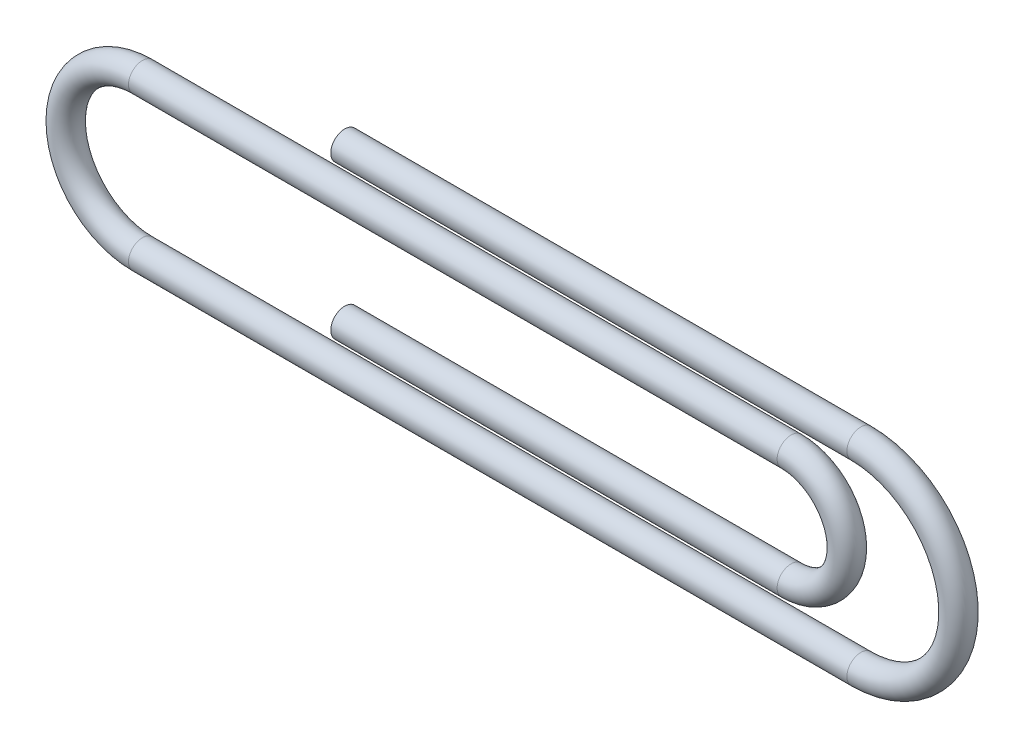
ISO-10303-21;
HEADER;
FILE_DESCRIPTION(('STEP AP214'),'2;1');
FILE_NAME('part.step','',(''),(''),'','','');
FILE_SCHEMA(('AUTOMOTIVE_DESIGN { 1 0 10303 214 1 1 1 1 }'));
ENDSEC;
DATA;
#1=APPLICATION_CONTEXT('core data for automotive mechanical design processes');
#2=APPLICATION_PROTOCOL_DEFINITION('international standard','automotive_design',2000,#1);
#3=PRODUCT_CONTEXT('',#1,'mechanical');
#4=PRODUCT('Part','Part','',(#3));
#5=PRODUCT_RELATED_PRODUCT_CATEGORY('part','',(#4));
#6=PRODUCT_DEFINITION_FORMATION('','',#4);
#7=PRODUCT_DEFINITION_CONTEXT('part definition',#1,'design');
#8=PRODUCT_DEFINITION('design','',#6,#7);
#9=PRODUCT_DEFINITION_SHAPE('','',#8);
#10=(LENGTH_UNIT() NAMED_UNIT(*) SI_UNIT(.MILLI.,.METRE.));
#11=(NAMED_UNIT(*) PLANE_ANGLE_UNIT() SI_UNIT($,.RADIAN.));
#12=(NAMED_UNIT(*) SI_UNIT($,.STERADIAN.) SOLID_ANGLE_UNIT());
#13=UNCERTAINTY_MEASURE_WITH_UNIT(LENGTH_MEASURE(1.E-05),#10,'distance_accuracy_value','');
#14=(GEOMETRIC_REPRESENTATION_CONTEXT(3) GLOBAL_UNCERTAINTY_ASSIGNED_CONTEXT((#13)) GLOBAL_UNIT_ASSIGNED_CONTEXT((#10,
#11,#12)) REPRESENTATION_CONTEXT('',''));
#15=CARTESIAN_POINT('',(0.,0.,0.));
#16=DIRECTION('',(0.,0.,1.));
#17=DIRECTION('',(1.,0.,0.));
#18=AXIS2_PLACEMENT_3D('',#15,#16,#17);
#19=CARTESIAN_POINT('',(0.,0.,0.));
#20=DIRECTION('',(1.,0.,0.));
#21=DIRECTION('',(0.,0.,-1.));
#22=AXIS2_PLACEMENT_3D('',#19,#20,#21);
#23=PLANE('',#22);
#24=CARTESIAN_POINT('',(0.,0.,0.));
#25=DIRECTION('',(1.,0.,0.));
#26=DIRECTION('',(0.,0.,-1.));
#27=AXIS2_PLACEMENT_3D('',#24,#25,#26);
#28=CIRCLE('',#27,0.5);
#29=CARTESIAN_POINT('',(0.,0.,-0.5));
#30=VERTEX_POINT('',#29);
#31=EDGE_CURVE('E72',#30,#30,#28,.T.);
#32=ORIENTED_EDGE('',*,*,#31,.F.);
#33=EDGE_LOOP('',(#32));
#34=FACE_BOUND('',#33,.T.);
#35=ADVANCED_FACE('F37',(#34),#23,.F.);
#36=CARTESIAN_POINT('',(0.,-5.5,0.));
#37=DIRECTION('',(-1.,0.,0.));
#38=DIRECTION('',(0.,0.,-1.));
#39=AXIS2_PLACEMENT_3D('',#36,#37,#38);
#40=PLANE('',#39);
#41=CARTESIAN_POINT('',(0.,-5.5,0.));
#42=DIRECTION('',(-1.,0.,0.));
#43=DIRECTION('',(0.,0.,-1.));
#44=AXIS2_PLACEMENT_3D('',#41,#42,#43);
#45=CIRCLE('',#44,0.5);
#46=CARTESIAN_POINT('',(0.,-5.5,-0.5));
#47=VERTEX_POINT('',#46);
#48=EDGE_CURVE('E10',#47,#47,#45,.T.);
#49=ORIENTED_EDGE('',*,*,#48,.T.);
#50=EDGE_LOOP('',(#49));
#51=FACE_BOUND('',#50,.T.);
#52=ADVANCED_FACE('F80',(#51),#40,.T.);
#53=CARTESIAN_POINT('',(0.,0.,0.));
#54=DIRECTION('',(1.,0.,0.));
#55=DIRECTION('',(0.,0.,-1.));
#56=AXIS2_PLACEMENT_3D('',#53,#54,#55);
#57=CYLINDRICAL_SURFACE('',#56,0.5);
#58=CARTESIAN_POINT('',(18.5,0.,0.));
#59=DIRECTION('',(1.,0.,0.));
#60=DIRECTION('',(0.,0.,-1.));
#61=AXIS2_PLACEMENT_3D('',#58,#59,#60);
#62=CIRCLE('',#61,0.5);
#63=CARTESIAN_POINT('',(18.5,0.5,0.));
#64=VERTEX_POINT('',#63);
#65=EDGE_CURVE('E68',#64,#64,#62,.T.);
#66=ORIENTED_EDGE('',*,*,#65,.F.);
#67=EDGE_LOOP('',(#66));
#68=FACE_BOUND('',#67,.T.);
#69=ORIENTED_EDGE('',*,*,#31,.T.);
#70=EDGE_LOOP('',(#69));
#71=FACE_BOUND('',#70,.T.);
#72=ADVANCED_FACE('F77',(#68,#71),#57,.T.);
#73=CARTESIAN_POINT('',(18.5,-3.5,0.));
#74=DIRECTION('',(0.,0.,-1.));
#75=DIRECTION('',(-1.,0.,0.));
#76=AXIS2_PLACEMENT_3D('',#73,#74,#75);
#77=TOROIDAL_SURFACE('',#76,3.5,0.5);
#78=CARTESIAN_POINT('',(18.5,-7.,0.));
#79=DIRECTION('',(-1.,0.,0.));
#80=DIRECTION('',(0.,0.,-1.));
#81=AXIS2_PLACEMENT_3D('',#78,#79,#80);
#82=CIRCLE('',#81,0.5);
#83=CARTESIAN_POINT('',(18.5,-7.5,0.));
#84=VERTEX_POINT('',#83);
#85=EDGE_CURVE('E64',#84,#84,#82,.T.);
#86=CARTESIAN_POINT('',(18.5,-3.5,0.));
#87=DIRECTION('',(0.,0.,-1.));
#88=DIRECTION('',(-1.,0.,0.));
#89=AXIS2_PLACEMENT_3D('',#86,#87,#88);
#90=CIRCLE('',#89,4.);
#91=EDGE_CURVE('',#64,#84,#90,.T.);
#92=ORIENTED_EDGE('',*,*,#65,.T.);
#93=ORIENTED_EDGE('',*,*,#85,.F.);
#94=ORIENTED_EDGE('',*,*,#91,.T.);
#95=ORIENTED_EDGE('',*,*,#91,.F.);
#96=EDGE_LOOP('',(#92,#94,#93,#95));
#97=FACE_BOUND('',#96,.T.);
#98=ADVANCED_FACE('F106',(#97),#77,.T.);
#99=CARTESIAN_POINT('',(18.5,-7.,0.));
#100=DIRECTION('',(-1.,0.,0.));
#101=DIRECTION('',(0.,-1.,0.));
#102=AXIS2_PLACEMENT_3D('',#99,#100,#101);
#103=CYLINDRICAL_SURFACE('',#102,0.5);
#104=CARTESIAN_POINT('',(-7.25,-7.,0.));
#105=DIRECTION('',(-1.,0.,0.));
#106=DIRECTION('',(0.,0.,-1.));
#107=AXIS2_PLACEMENT_3D('',#104,#105,#106);
#108=CIRCLE('',#107,0.5);
#109=CARTESIAN_POINT('',(-7.25,-7.5,0.));
#110=VERTEX_POINT('',#109);
#111=EDGE_CURVE('E60',#110,#110,#108,.T.);
#112=ORIENTED_EDGE('',*,*,#111,.F.);
#113=EDGE_LOOP('',(#112));
#114=FACE_BOUND('',#113,.T.);
#115=ORIENTED_EDGE('',*,*,#85,.T.);
#116=EDGE_LOOP('',(#115));
#117=FACE_BOUND('',#116,.T.);
#118=ADVANCED_FACE('F102',(#114,#117),#103,.T.);
#119=CARTESIAN_POINT('',(-7.25,-4.25,0.));
#120=DIRECTION('',(0.,0.,-1.));
#121=DIRECTION('',(-1.,0.,0.));
#122=AXIS2_PLACEMENT_3D('',#119,#120,#121);
#123=TOROIDAL_SURFACE('',#122,2.75,0.5);
#124=CARTESIAN_POINT('',(-7.25,-1.5,0.));
#125=DIRECTION('',(1.,0.,0.));
#126=DIRECTION('',(0.,0.,-1.));
#127=AXIS2_PLACEMENT_3D('',#124,#125,#126);
#128=CIRCLE('',#127,0.5);
#129=CARTESIAN_POINT('',(-7.25,-1.,0.));
#130=VERTEX_POINT('',#129);
#131=EDGE_CURVE('E54',#130,#130,#128,.T.);
#132=CARTESIAN_POINT('',(-7.25,-4.25,0.));
#133=DIRECTION('',(0.,0.,-1.));
#134=DIRECTION('',(-1.,0.,0.));
#135=AXIS2_PLACEMENT_3D('',#132,#133,#134);
#136=CIRCLE('',#135,3.25);
#137=EDGE_CURVE('',#110,#130,#136,.T.);
#138=ORIENTED_EDGE('',*,*,#111,.T.);
#139=ORIENTED_EDGE('',*,*,#131,.F.);
#140=ORIENTED_EDGE('',*,*,#137,.T.);
#141=ORIENTED_EDGE('',*,*,#137,.F.);
#142=EDGE_LOOP('',(#138,#140,#139,#141));
#143=FACE_BOUND('',#142,.T.);
#144=ADVANCED_FACE('F98',(#143),#123,.T.);
#145=CARTESIAN_POINT('',(-7.25,-1.5,0.));
#146=DIRECTION('',(1.,0.,0.));
#147=DIRECTION('',(0.,1.,0.));
#148=AXIS2_PLACEMENT_3D('',#145,#146,#147);
#149=CYLINDRICAL_SURFACE('',#148,0.5);
#150=CARTESIAN_POINT('',(16.,-1.5,0.));
#151=DIRECTION('',(1.,0.,0.));
#152=DIRECTION('',(0.,0.,-1.));
#153=AXIS2_PLACEMENT_3D('',#150,#151,#152);
#154=CIRCLE('',#153,0.5);
#155=CARTESIAN_POINT('',(16.,-1.,0.));
#156=VERTEX_POINT('',#155);
#157=EDGE_CURVE('E49',#156,#156,#154,.T.);
#158=ORIENTED_EDGE('',*,*,#157,.F.);
#159=EDGE_LOOP('',(#158));
#160=FACE_BOUND('',#159,.T.);
#161=ORIENTED_EDGE('',*,*,#131,.T.);
#162=EDGE_LOOP('',(#161));
#163=FACE_BOUND('',#162,.T.);
#164=ADVANCED_FACE('F92',(#160,#163),#149,.T.);
#165=CARTESIAN_POINT('',(16.,-3.5,0.));
#166=DIRECTION('',(0.,0.,-1.));
#167=DIRECTION('',(-1.,0.,0.));
#168=AXIS2_PLACEMENT_3D('',#165,#166,#167);
#169=TOROIDAL_SURFACE('',#168,2.,0.5);
#170=CARTESIAN_POINT('',(16.,-5.5,0.));
#171=DIRECTION('',(-1.,0.,0.));
#172=DIRECTION('',(0.,0.,-1.));
#173=AXIS2_PLACEMENT_3D('',#170,#171,#172);
#174=CIRCLE('',#173,0.5);
#175=CARTESIAN_POINT('',(16.,-6.,0.));
#176=VERTEX_POINT('',#175);
#177=EDGE_CURVE('E44',#176,#176,#174,.T.);
#178=CARTESIAN_POINT('',(16.,-3.5,0.));
#179=DIRECTION('',(0.,0.,-1.));
#180=DIRECTION('',(-1.,0.,0.));
#181=AXIS2_PLACEMENT_3D('',#178,#179,#180);
#182=CIRCLE('',#181,2.5);
#183=EDGE_CURVE('',#156,#176,#182,.T.);
#184=ORIENTED_EDGE('',*,*,#157,.T.);
#185=ORIENTED_EDGE('',*,*,#177,.F.);
#186=ORIENTED_EDGE('',*,*,#183,.T.);
#187=ORIENTED_EDGE('',*,*,#183,.F.);
#188=EDGE_LOOP('',(#184,#186,#185,#187));
#189=FACE_BOUND('',#188,.T.);
#190=ADVANCED_FACE('F86',(#189),#169,.T.);
#191=CARTESIAN_POINT('',(16.,-5.5,0.));
#192=DIRECTION('',(-1.,0.,0.));
#193=DIRECTION('',(0.,-1.,0.));
#194=AXIS2_PLACEMENT_3D('',#191,#192,#193);
#195=CYLINDRICAL_SURFACE('',#194,0.5);
#196=ORIENTED_EDGE('',*,*,#48,.F.);
#197=EDGE_LOOP('',(#196));
#198=FACE_BOUND('',#197,.T.);
#199=ORIENTED_EDGE('',*,*,#177,.T.);
#200=EDGE_LOOP('',(#199));
#201=FACE_BOUND('',#200,.T.);
#202=ADVANCED_FACE('F84',(#198,#201),#195,.T.);
#203=CLOSED_SHELL('',(#35,#52,#72,#98,#118,#144,#164,#190,#202));
#204=MANIFOLD_SOLID_BREP('B2',#203);
#205=ADVANCED_BREP_SHAPE_REPRESENTATION('',(#18,#204),#14);
#206=SHAPE_DEFINITION_REPRESENTATION(#9,#205);
ENDSEC;
END-ISO-10303-21;
